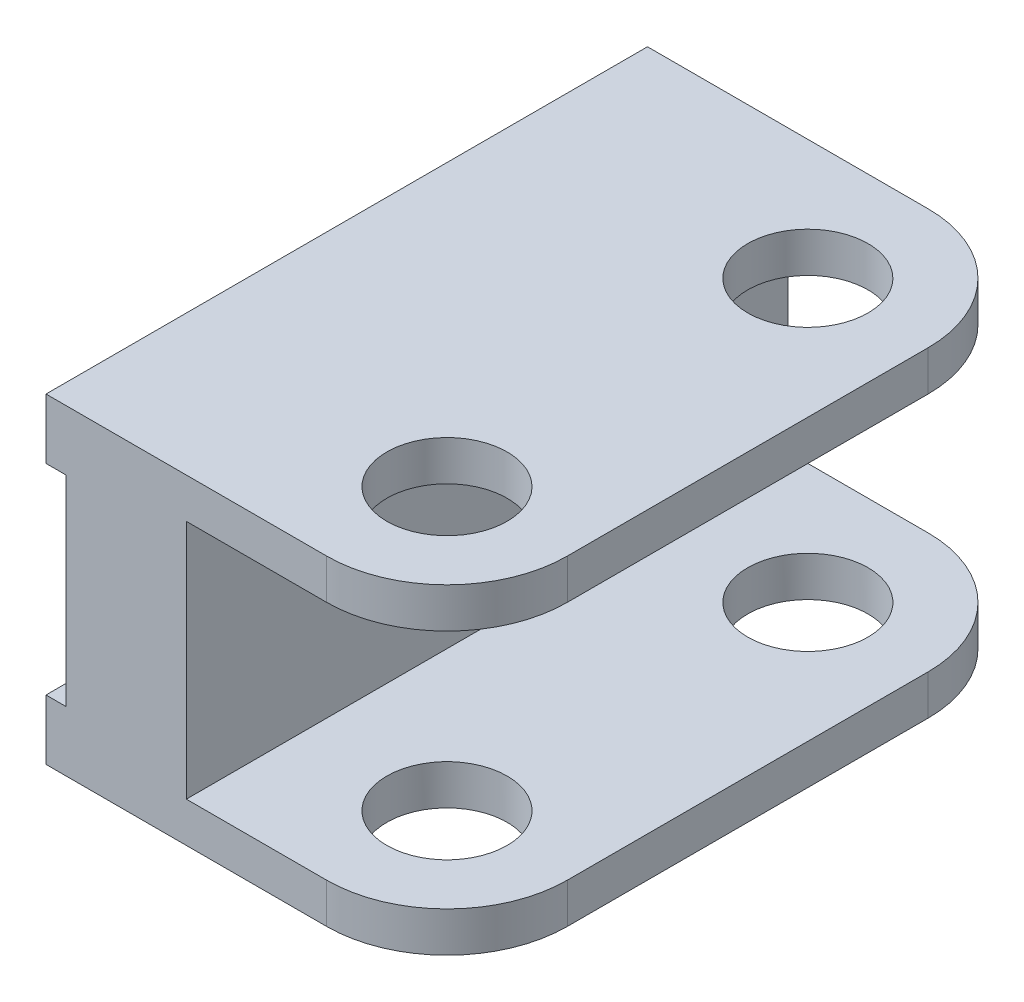
ISO-10303-21;
HEADER;
FILE_DESCRIPTION(('STEP AP214'),'2;1');
FILE_NAME('part.step','',(''),(''),'','','');
FILE_SCHEMA(('AUTOMOTIVE_DESIGN { 1 0 10303 214 1 1 1 1 }'));
ENDSEC;
DATA;
#1=APPLICATION_CONTEXT('core data for automotive mechanical design processes');
#2=APPLICATION_PROTOCOL_DEFINITION('international standard','automotive_design',2000,#1);
#3=PRODUCT_CONTEXT('',#1,'mechanical');
#4=PRODUCT('Part','Part','',(#3));
#5=PRODUCT_RELATED_PRODUCT_CATEGORY('part','',(#4));
#6=PRODUCT_DEFINITION_FORMATION('','',#4);
#7=PRODUCT_DEFINITION_CONTEXT('part definition',#1,'design');
#8=PRODUCT_DEFINITION('design','',#6,#7);
#9=PRODUCT_DEFINITION_SHAPE('','',#8);
#10=(LENGTH_UNIT() NAMED_UNIT(*) SI_UNIT(.MILLI.,.METRE.));
#11=(NAMED_UNIT(*) PLANE_ANGLE_UNIT() SI_UNIT($,.RADIAN.));
#12=(NAMED_UNIT(*) SI_UNIT($,.STERADIAN.) SOLID_ANGLE_UNIT());
#13=UNCERTAINTY_MEASURE_WITH_UNIT(LENGTH_MEASURE(1.E-05),#10,'distance_accuracy_value','');
#14=(GEOMETRIC_REPRESENTATION_CONTEXT(3) GLOBAL_UNCERTAINTY_ASSIGNED_CONTEXT((#13)) GLOBAL_UNIT_ASSIGNED_CONTEXT((#10,
#11,#12)) REPRESENTATION_CONTEXT('',''));
#15=CARTESIAN_POINT('',(0.,0.,0.));
#16=DIRECTION('',(0.,0.,1.));
#17=DIRECTION('',(1.,0.,0.));
#18=AXIS2_PLACEMENT_3D('',#15,#16,#17);
#19=CARTESIAN_POINT('',(0.,0.,150.));
#20=DIRECTION('',(1.,0.,0.));
#21=DIRECTION('',(0.,1.,0.));
#22=AXIS2_PLACEMENT_3D('',#19,#20,#21);
#23=PLANE('',#22);
#24=DIRECTION('',(0.,-1.,0.));
#25=VECTOR('',#24,1.);
#26=CARTESIAN_POINT('',(0.,0.,0.));
#27=LINE('',#26,#25);
#28=CARTESIAN_POINT('',(0.,80.,0.));
#29=VERTEX_POINT('',#28);
#30=CARTESIAN_POINT('',(0.,65.,0.));
#31=VERTEX_POINT('',#30);
#32=EDGE_CURVE('E175',#29,#31,#27,.T.);
#33=ORIENTED_EDGE('',*,*,#32,.T.);
#34=DIRECTION('',(0.,0.,1.));
#35=VECTOR('',#34,1.);
#36=CARTESIAN_POINT('',(0.,65.,0.));
#37=LINE('',#36,#35);
#38=CARTESIAN_POINT('',(0.,65.,150.));
#39=VERTEX_POINT('',#38);
#40=EDGE_CURVE('E176',#31,#39,#37,.T.);
#41=ORIENTED_EDGE('',*,*,#40,.T.);
#42=DIRECTION('',(0.,-1.,0.));
#43=VECTOR('',#42,1.);
#44=CARTESIAN_POINT('',(0.,0.,150.));
#45=LINE('',#44,#43);
#46=CARTESIAN_POINT('',(0.,80.,150.));
#47=VERTEX_POINT('',#46);
#48=EDGE_CURVE('E269',#47,#39,#45,.T.);
#49=ORIENTED_EDGE('',*,*,#48,.F.);
#50=DIRECTION('',(0.,0.,-1.));
#51=VECTOR('',#50,1.);
#52=CARTESIAN_POINT('',(0.,80.,150.));
#53=LINE('',#52,#51);
#54=EDGE_CURVE('E196',#47,#29,#53,.T.);
#55=ORIENTED_EDGE('',*,*,#54,.T.);
#56=EDGE_LOOP('',(#33,#41,#49,#55));
#57=FACE_BOUND('',#56,.T.);
#58=ADVANCED_FACE('F33',(#57),#23,.F.);
#59=CARTESIAN_POINT('',(0.,15.,150.));
#60=VERTEX_POINT('',#59);
#61=CARTESIAN_POINT('',(0.,0.,150.));
#62=VERTEX_POINT('',#61);
#63=EDGE_CURVE('E167',#60,#62,#45,.T.);
#64=ORIENTED_EDGE('',*,*,#63,.F.);
#65=DIRECTION('',(0.,0.,1.));
#66=VECTOR('',#65,1.);
#67=CARTESIAN_POINT('',(0.,15.,0.));
#68=LINE('',#67,#66);
#69=CARTESIAN_POINT('',(0.,15.,0.));
#70=VERTEX_POINT('',#69);
#71=EDGE_CURVE('E152',#70,#60,#68,.T.);
#72=ORIENTED_EDGE('',*,*,#71,.F.);
#73=CARTESIAN_POINT('',(0.,0.,0.));
#74=VERTEX_POINT('',#73);
#75=EDGE_CURVE('E165',#70,#74,#27,.T.);
#76=ORIENTED_EDGE('',*,*,#75,.T.);
#77=DIRECTION('',(0.,0.,-1.));
#78=VECTOR('',#77,1.);
#79=CARTESIAN_POINT('',(0.,0.,150.));
#80=LINE('',#79,#78);
#81=EDGE_CURVE('E217',#62,#74,#80,.T.);
#82=ORIENTED_EDGE('',*,*,#81,.F.);
#83=EDGE_LOOP('',(#64,#72,#76,#82));
#84=FACE_BOUND('',#83,.T.);
#85=ADVANCED_FACE('F163',(#84),#23,.F.);
#86=CARTESIAN_POINT('',(35.,0.,150.));
#87=DIRECTION('',(0.,1.,0.));
#88=DIRECTION('',(0.,0.,1.));
#89=AXIS2_PLACEMENT_3D('',#86,#87,#88);
#90=PLANE('',#89);
#91=CARTESIAN_POINT('',(70.,0.,120.));
#92=DIRECTION('',(0.,1.,0.));
#93=DIRECTION('',(0.,0.,1.));
#94=AXIS2_PLACEMENT_3D('',#91,#92,#93);
#95=CIRCLE('',#94,15.);
#96=CARTESIAN_POINT('',(70.,0.,135.));
#97=VERTEX_POINT('',#96);
#98=EDGE_CURVE('E294',#97,#97,#95,.T.);
#99=ORIENTED_EDGE('',*,*,#98,.T.);
#100=EDGE_LOOP('',(#99));
#101=FACE_BOUND('',#100,.T.);
#102=CARTESIAN_POINT('',(70.,0.,30.));
#103=DIRECTION('',(0.,1.,0.));
#104=DIRECTION('',(0.,0.,1.));
#105=AXIS2_PLACEMENT_3D('',#102,#103,#104);
#106=CIRCLE('',#105,15.);
#107=CARTESIAN_POINT('',(70.,0.,45.));
#108=VERTEX_POINT('',#107);
#109=EDGE_CURVE('E279',#108,#108,#106,.T.);
#110=ORIENTED_EDGE('',*,*,#109,.T.);
#111=EDGE_LOOP('',(#110));
#112=FACE_BOUND('',#111,.T.);
#113=DIRECTION('',(1.,0.,0.));
#114=VECTOR('',#113,1.);
#115=CARTESIAN_POINT('',(35.,0.,0.));
#116=LINE('',#115,#114);
#117=CARTESIAN_POINT('',(70.,0.,0.));
#118=VERTEX_POINT('',#117);
#119=EDGE_CURVE('E173',#74,#118,#116,.T.);
#120=ORIENTED_EDGE('',*,*,#119,.T.);
#121=CARTESIAN_POINT('',(70.,0.,30.));
#122=DIRECTION('',(0.,1.,0.));
#123=DIRECTION('',(0.,0.,1.));
#124=AXIS2_PLACEMENT_3D('',#121,#122,#123);
#125=CIRCLE('',#124,30.);
#126=CARTESIAN_POINT('',(100.,0.,30.));
#127=VERTEX_POINT('',#126);
#128=EDGE_CURVE('E245',#118,#127,#125,.F.);
#129=ORIENTED_EDGE('',*,*,#128,.T.);
#130=DIRECTION('',(0.,0.,-1.));
#131=VECTOR('',#130,1.);
#132=CARTESIAN_POINT('',(100.,0.,150.));
#133=LINE('',#132,#131);
#134=CARTESIAN_POINT('',(100.,0.,120.));
#135=VERTEX_POINT('',#134);
#136=EDGE_CURVE('E214',#135,#127,#133,.T.);
#137=ORIENTED_EDGE('',*,*,#136,.F.);
#138=CARTESIAN_POINT('',(70.,0.,120.));
#139=DIRECTION('',(0.,1.,0.));
#140=DIRECTION('',(0.,0.,1.));
#141=AXIS2_PLACEMENT_3D('',#138,#139,#140);
#142=CIRCLE('',#141,30.);
#143=CARTESIAN_POINT('',(70.,0.,150.));
#144=VERTEX_POINT('',#143);
#145=EDGE_CURVE('E48',#135,#144,#142,.F.);
#146=ORIENTED_EDGE('',*,*,#145,.T.);
#147=DIRECTION('',(1.,0.,0.));
#148=VECTOR('',#147,1.);
#149=CARTESIAN_POINT('',(0.,0.,150.));
#150=LINE('',#149,#148);
#151=EDGE_CURVE('E267',#62,#144,#150,.T.);
#152=ORIENTED_EDGE('',*,*,#151,.F.);
#153=ORIENTED_EDGE('',*,*,#81,.T.);
#154=EDGE_LOOP('',(#120,#129,#137,#146,#152,#153));
#155=FACE_BOUND('',#154,.T.);
#156=ADVANCED_FACE('F349',(#101,#112,#155),#90,.F.);
#157=CARTESIAN_POINT('',(100.,0.,150.));
#158=DIRECTION('',(-1.,0.,0.));
#159=DIRECTION('',(0.,0.,1.));
#160=AXIS2_PLACEMENT_3D('',#157,#158,#159);
#161=PLANE('',#160);
#162=ORIENTED_EDGE('',*,*,#136,.T.);
#163=DIRECTION('',(0.,1.,0.));
#164=VECTOR('',#163,1.);
#165=CARTESIAN_POINT('',(100.,10.,30.));
#166=LINE('',#165,#164);
#167=CARTESIAN_POINT('',(100.,10.,30.));
#168=VERTEX_POINT('',#167);
#169=EDGE_CURVE('E238',#127,#168,#166,.T.);
#170=ORIENTED_EDGE('',*,*,#169,.T.);
#171=DIRECTION('',(0.,0.,-1.));
#172=VECTOR('',#171,1.);
#173=CARTESIAN_POINT('',(100.,10.,150.));
#174=LINE('',#173,#172);
#175=CARTESIAN_POINT('',(100.,10.,120.));
#176=VERTEX_POINT('',#175);
#177=EDGE_CURVE('E211',#176,#168,#174,.T.);
#178=ORIENTED_EDGE('',*,*,#177,.F.);
#179=DIRECTION('',(0.,1.,0.));
#180=VECTOR('',#179,1.);
#181=CARTESIAN_POINT('',(100.,0.,120.));
#182=LINE('',#181,#180);
#183=EDGE_CURVE('E236',#176,#135,#182,.F.);
#184=ORIENTED_EDGE('',*,*,#183,.T.);
#185=EDGE_LOOP('',(#162,#170,#178,#184));
#186=FACE_BOUND('',#185,.T.);
#187=ADVANCED_FACE('F357',(#186),#161,.F.);
#188=CARTESIAN_POINT('',(35.,10.,150.));
#189=DIRECTION('',(0.,-1.,0.));
#190=DIRECTION('',(0.,0.,-1.));
#191=AXIS2_PLACEMENT_3D('',#188,#189,#190);
#192=PLANE('',#191);
#193=CARTESIAN_POINT('',(70.,9.99999999999999,120.));
#194=DIRECTION('',(0.,-1.,0.));
#195=DIRECTION('',(0.,0.,-1.));
#196=AXIS2_PLACEMENT_3D('',#193,#194,#195);
#197=CIRCLE('',#196,15.);
#198=CARTESIAN_POINT('',(70.,9.99999999999999,105.));
#199=VERTEX_POINT('',#198);
#200=EDGE_CURVE('E297',#199,#199,#197,.T.);
#201=ORIENTED_EDGE('',*,*,#200,.T.);
#202=EDGE_LOOP('',(#201));
#203=FACE_BOUND('',#202,.T.);
#204=CARTESIAN_POINT('',(70.,9.99999999999999,30.));
#205=DIRECTION('',(0.,-1.,0.));
#206=DIRECTION('',(0.,0.,-1.));
#207=AXIS2_PLACEMENT_3D('',#204,#205,#206);
#208=CIRCLE('',#207,15.);
#209=CARTESIAN_POINT('',(70.,9.99999999999999,15.));
#210=VERTEX_POINT('',#209);
#211=EDGE_CURVE('E285',#210,#210,#208,.T.);
#212=ORIENTED_EDGE('',*,*,#211,.T.);
#213=EDGE_LOOP('',(#212));
#214=FACE_BOUND('',#213,.T.);
#215=ORIENTED_EDGE('',*,*,#177,.T.);
#216=CARTESIAN_POINT('',(70.,10.,30.));
#217=DIRECTION('',(0.,-1.,0.));
#218=DIRECTION('',(0.,0.,-1.));
#219=AXIS2_PLACEMENT_3D('',#216,#217,#218);
#220=CIRCLE('',#219,30.);
#221=CARTESIAN_POINT('',(70.,10.,0.));
#222=VERTEX_POINT('',#221);
#223=EDGE_CURVE('E242',#168,#222,#220,.F.);
#224=ORIENTED_EDGE('',*,*,#223,.T.);
#225=DIRECTION('',(-1.,0.,0.));
#226=VECTOR('',#225,1.);
#227=CARTESIAN_POINT('',(35.,10.,0.));
#228=LINE('',#227,#226);
#229=CARTESIAN_POINT('',(35.,10.,0.));
#230=VERTEX_POINT('',#229);
#231=EDGE_CURVE('E187',#222,#230,#228,.T.);
#232=ORIENTED_EDGE('',*,*,#231,.T.);
#233=DIRECTION('',(0.,0.,-1.));
#234=VECTOR('',#233,1.);
#235=CARTESIAN_POINT('',(35.,10.,150.));
#236=LINE('',#235,#234);
#237=CARTESIAN_POINT('',(35.,10.,150.));
#238=VERTEX_POINT('',#237);
#239=EDGE_CURVE('E208',#238,#230,#236,.T.);
#240=ORIENTED_EDGE('',*,*,#239,.F.);
#241=DIRECTION('',(-1.,0.,0.));
#242=VECTOR('',#241,1.);
#243=CARTESIAN_POINT('',(35.,10.,150.));
#244=LINE('',#243,#242);
#245=CARTESIAN_POINT('',(70.,10.,150.));
#246=VERTEX_POINT('',#245);
#247=EDGE_CURVE('E263',#246,#238,#244,.T.);
#248=ORIENTED_EDGE('',*,*,#247,.F.);
#249=CARTESIAN_POINT('',(70.,10.,120.));
#250=DIRECTION('',(0.,-1.,0.));
#251=DIRECTION('',(0.,0.,-1.));
#252=AXIS2_PLACEMENT_3D('',#249,#250,#251);
#253=CIRCLE('',#252,30.);
#254=EDGE_CURVE('E56',#246,#176,#253,.F.);
#255=ORIENTED_EDGE('',*,*,#254,.T.);
#256=EDGE_LOOP('',(#215,#224,#232,#240,#248,#255));
#257=FACE_BOUND('',#256,.T.);
#258=ADVANCED_FACE('F359',(#203,#214,#257),#192,.F.);
#259=CARTESIAN_POINT('',(35.,10.,150.));
#260=DIRECTION('',(-1.,0.,0.));
#261=DIRECTION('',(0.,-1.,0.));
#262=AXIS2_PLACEMENT_3D('',#259,#260,#261);
#263=PLANE('',#262);
#264=DIRECTION('',(0.,1.,0.));
#265=VECTOR('',#264,1.);
#266=CARTESIAN_POINT('',(35.,10.,0.));
#267=LINE('',#266,#265);
#268=CARTESIAN_POINT('',(35.,70.,0.));
#269=VERTEX_POINT('',#268);
#270=EDGE_CURVE('E189',#230,#269,#267,.T.);
#271=ORIENTED_EDGE('',*,*,#270,.T.);
#272=DIRECTION('',(0.,0.,-1.));
#273=VECTOR('',#272,1.);
#274=CARTESIAN_POINT('',(35.,70.,150.));
#275=LINE('',#274,#273);
#276=CARTESIAN_POINT('',(35.,70.,150.));
#277=VERTEX_POINT('',#276);
#278=EDGE_CURVE('E205',#277,#269,#275,.T.);
#279=ORIENTED_EDGE('',*,*,#278,.F.);
#280=DIRECTION('',(0.,1.,0.));
#281=VECTOR('',#280,1.);
#282=CARTESIAN_POINT('',(35.,10.,150.));
#283=LINE('',#282,#281);
#284=EDGE_CURVE('E262',#238,#277,#283,.T.);
#285=ORIENTED_EDGE('',*,*,#284,.F.);
#286=ORIENTED_EDGE('',*,*,#239,.T.);
#287=EDGE_LOOP('',(#271,#279,#285,#286));
#288=FACE_BOUND('',#287,.T.);
#289=ADVANCED_FACE('F326',(#288),#263,.F.);
#290=CARTESIAN_POINT('',(35.,70.,150.));
#291=DIRECTION('',(0.,1.,0.));
#292=DIRECTION('',(0.,0.,1.));
#293=AXIS2_PLACEMENT_3D('',#290,#291,#292);
#294=PLANE('',#293);
#295=CARTESIAN_POINT('',(70.,70.,120.));
#296=DIRECTION('',(0.,1.,0.));
#297=DIRECTION('',(0.,0.,1.));
#298=AXIS2_PLACEMENT_3D('',#295,#296,#297);
#299=CIRCLE('',#298,15.);
#300=CARTESIAN_POINT('',(70.,70.,135.));
#301=VERTEX_POINT('',#300);
#302=EDGE_CURVE('E300',#301,#301,#299,.T.);
#303=ORIENTED_EDGE('',*,*,#302,.T.);
#304=EDGE_LOOP('',(#303));
#305=FACE_BOUND('',#304,.T.);
#306=CARTESIAN_POINT('',(70.,70.,30.));
#307=DIRECTION('',(0.,1.,0.));
#308=DIRECTION('',(0.,0.,1.));
#309=AXIS2_PLACEMENT_3D('',#306,#307,#308);
#310=CIRCLE('',#309,15.);
#311=CARTESIAN_POINT('',(70.,70.,45.));
#312=VERTEX_POINT('',#311);
#313=EDGE_CURVE('E288',#312,#312,#310,.T.);
#314=ORIENTED_EDGE('',*,*,#313,.T.);
#315=EDGE_LOOP('',(#314));
#316=FACE_BOUND('',#315,.T.);
#317=DIRECTION('',(1.,0.,0.));
#318=VECTOR('',#317,1.);
#319=CARTESIAN_POINT('',(35.,70.,0.));
#320=LINE('',#319,#318);
#321=CARTESIAN_POINT('',(70.,70.,0.));
#322=VERTEX_POINT('',#321);
#323=EDGE_CURVE('E191',#269,#322,#320,.T.);
#324=ORIENTED_EDGE('',*,*,#323,.T.);
#325=CARTESIAN_POINT('',(70.,70.,30.));
#326=DIRECTION('',(0.,1.,0.));
#327=DIRECTION('',(0.,0.,1.));
#328=AXIS2_PLACEMENT_3D('',#325,#326,#327);
#329=CIRCLE('',#328,30.);
#330=CARTESIAN_POINT('',(100.,70.,30.));
#331=VERTEX_POINT('',#330);
#332=EDGE_CURVE('E234',#322,#331,#329,.F.);
#333=ORIENTED_EDGE('',*,*,#332,.T.);
#334=DIRECTION('',(0.,0.,-1.));
#335=VECTOR('',#334,1.);
#336=CARTESIAN_POINT('',(100.,70.,150.));
#337=LINE('',#336,#335);
#338=CARTESIAN_POINT('',(100.,70.,120.));
#339=VERTEX_POINT('',#338);
#340=EDGE_CURVE('E202',#339,#331,#337,.T.);
#341=ORIENTED_EDGE('',*,*,#340,.F.);
#342=CARTESIAN_POINT('',(70.,70.,120.));
#343=DIRECTION('',(0.,1.,0.));
#344=DIRECTION('',(0.,0.,1.));
#345=AXIS2_PLACEMENT_3D('',#342,#343,#344);
#346=CIRCLE('',#345,30.);
#347=CARTESIAN_POINT('',(70.,70.,150.));
#348=VERTEX_POINT('',#347);
#349=EDGE_CURVE('E232',#339,#348,#346,.F.);
#350=ORIENTED_EDGE('',*,*,#349,.T.);
#351=DIRECTION('',(1.,0.,0.));
#352=VECTOR('',#351,1.);
#353=CARTESIAN_POINT('',(35.,70.,150.));
#354=LINE('',#353,#352);
#355=EDGE_CURVE('E255',#277,#348,#354,.T.);
#356=ORIENTED_EDGE('',*,*,#355,.F.);
#357=ORIENTED_EDGE('',*,*,#278,.T.);
#358=EDGE_LOOP('',(#324,#333,#341,#350,#356,#357));
#359=FACE_BOUND('',#358,.T.);
#360=ADVANCED_FACE('F323',(#305,#316,#359),#294,.F.);
#361=CARTESIAN_POINT('',(100.,80.,150.));
#362=DIRECTION('',(-1.,0.,0.));
#363=DIRECTION('',(0.,-1.,0.));
#364=AXIS2_PLACEMENT_3D('',#361,#362,#363);
#365=PLANE('',#364);
#366=ORIENTED_EDGE('',*,*,#340,.T.);
#367=DIRECTION('',(0.,1.,0.));
#368=VECTOR('',#367,1.);
#369=CARTESIAN_POINT('',(100.,80.,30.));
#370=LINE('',#369,#368);
#371=CARTESIAN_POINT('',(100.,80.,30.));
#372=VERTEX_POINT('',#371);
#373=EDGE_CURVE('E221',#331,#372,#370,.T.);
#374=ORIENTED_EDGE('',*,*,#373,.T.);
#375=DIRECTION('',(0.,0.,-1.));
#376=VECTOR('',#375,1.);
#377=CARTESIAN_POINT('',(100.,80.,150.));
#378=LINE('',#377,#376);
#379=CARTESIAN_POINT('',(100.,80.,120.));
#380=VERTEX_POINT('',#379);
#381=EDGE_CURVE('E199',#380,#372,#378,.T.);
#382=ORIENTED_EDGE('',*,*,#381,.F.);
#383=DIRECTION('',(0.,1.,0.));
#384=VECTOR('',#383,1.);
#385=CARTESIAN_POINT('',(100.,80.,120.));
#386=LINE('',#385,#384);
#387=EDGE_CURVE('E219',#380,#339,#386,.F.);
#388=ORIENTED_EDGE('',*,*,#387,.T.);
#389=EDGE_LOOP('',(#366,#374,#382,#388));
#390=FACE_BOUND('',#389,.T.);
#391=ADVANCED_FACE('F312',(#390),#365,.F.);
#392=CARTESIAN_POINT('',(0.,80.,150.));
#393=DIRECTION('',(0.,-1.,0.));
#394=DIRECTION('',(0.,0.,-1.));
#395=AXIS2_PLACEMENT_3D('',#392,#393,#394);
#396=PLANE('',#395);
#397=CARTESIAN_POINT('',(70.,80.,120.));
#398=DIRECTION('',(0.,1.,0.));
#399=DIRECTION('',(0.,0.,1.));
#400=AXIS2_PLACEMENT_3D('',#397,#398,#399);
#401=CIRCLE('',#400,15.);
#402=CARTESIAN_POINT('',(70.,80.,135.));
#403=VERTEX_POINT('',#402);
#404=EDGE_CURVE('E303',#403,#403,#401,.T.);
#405=ORIENTED_EDGE('',*,*,#404,.F.);
#406=EDGE_LOOP('',(#405));
#407=FACE_BOUND('',#406,.T.);
#408=CARTESIAN_POINT('',(70.,80.,30.));
#409=DIRECTION('',(0.,1.,0.));
#410=DIRECTION('',(0.,0.,1.));
#411=AXIS2_PLACEMENT_3D('',#408,#409,#410);
#412=CIRCLE('',#411,15.);
#413=CARTESIAN_POINT('',(70.,80.,45.));
#414=VERTEX_POINT('',#413);
#415=EDGE_CURVE('E291',#414,#414,#412,.T.);
#416=ORIENTED_EDGE('',*,*,#415,.F.);
#417=EDGE_LOOP('',(#416));
#418=FACE_BOUND('',#417,.T.);
#419=ORIENTED_EDGE('',*,*,#381,.T.);
#420=CARTESIAN_POINT('',(70.,80.,30.));
#421=DIRECTION('',(0.,-1.,0.));
#422=DIRECTION('',(0.,0.,-1.));
#423=AXIS2_PLACEMENT_3D('',#420,#421,#422);
#424=CIRCLE('',#423,30.);
#425=CARTESIAN_POINT('',(70.,80.,0.));
#426=VERTEX_POINT('',#425);
#427=EDGE_CURVE('E226',#372,#426,#424,.F.);
#428=ORIENTED_EDGE('',*,*,#427,.T.);
#429=DIRECTION('',(-1.,0.,0.));
#430=VECTOR('',#429,1.);
#431=CARTESIAN_POINT('',(0.,80.,0.));
#432=LINE('',#431,#430);
#433=EDGE_CURVE('E194',#426,#29,#432,.T.);
#434=ORIENTED_EDGE('',*,*,#433,.T.);
#435=ORIENTED_EDGE('',*,*,#54,.F.);
#436=DIRECTION('',(-1.,0.,0.));
#437=VECTOR('',#436,1.);
#438=CARTESIAN_POINT('',(35.,80.,150.));
#439=LINE('',#438,#437);
#440=CARTESIAN_POINT('',(70.,80.,150.));
#441=VERTEX_POINT('',#440);
#442=EDGE_CURVE('E184',#441,#47,#439,.T.);
#443=ORIENTED_EDGE('',*,*,#442,.F.);
#444=CARTESIAN_POINT('',(70.,80.,120.));
#445=DIRECTION('',(0.,-1.,0.));
#446=DIRECTION('',(0.,0.,-1.));
#447=AXIS2_PLACEMENT_3D('',#444,#445,#446);
#448=CIRCLE('',#447,30.);
#449=EDGE_CURVE('E224',#441,#380,#448,.F.);
#450=ORIENTED_EDGE('',*,*,#449,.T.);
#451=EDGE_LOOP('',(#419,#428,#434,#435,#443,#450));
#452=FACE_BOUND('',#451,.T.);
#453=ADVANCED_FACE('F259',(#407,#418,#452),#396,.F.);
#454=CARTESIAN_POINT('',(0.,0.,150.));
#455=DIRECTION('',(0.,0.,-1.));
#456=DIRECTION('',(-1.,0.,0.));
#457=AXIS2_PLACEMENT_3D('',#454,#455,#456);
#458=PLANE('',#457);
#459=ORIENTED_EDGE('',*,*,#151,.T.);
#460=DIRECTION('',(0.,1.,0.));
#461=VECTOR('',#460,1.);
#462=CARTESIAN_POINT('',(70.,0.,150.));
#463=LINE('',#462,#461);
#464=EDGE_CURVE('E11',#144,#246,#463,.T.);
#465=ORIENTED_EDGE('',*,*,#464,.T.);
#466=ORIENTED_EDGE('',*,*,#247,.T.);
#467=ORIENTED_EDGE('',*,*,#284,.T.);
#468=ORIENTED_EDGE('',*,*,#355,.T.);
#469=DIRECTION('',(0.,1.,0.));
#470=VECTOR('',#469,1.);
#471=CARTESIAN_POINT('',(70.0000000000001,0.,150.));
#472=LINE('',#471,#470);
#473=EDGE_CURVE('E41',#348,#441,#472,.T.);
#474=ORIENTED_EDGE('',*,*,#473,.T.);
#475=ORIENTED_EDGE('',*,*,#442,.T.);
#476=ORIENTED_EDGE('',*,*,#48,.T.);
#477=DIRECTION('',(-1.,0.,0.));
#478=VECTOR('',#477,1.);
#479=CARTESIAN_POINT('',(0.,65.,150.));
#480=LINE('',#479,#478);
#481=CARTESIAN_POINT('',(4.99999999999999,65.,150.));
#482=VERTEX_POINT('',#481);
#483=EDGE_CURVE('E159',#482,#39,#480,.T.);
#484=ORIENTED_EDGE('',*,*,#483,.F.);
#485=DIRECTION('',(0.,1.,0.));
#486=VECTOR('',#485,1.);
#487=CARTESIAN_POINT('',(4.99999999999999,65.,150.));
#488=LINE('',#487,#486);
#489=CARTESIAN_POINT('',(5.00000000000001,15.,150.));
#490=VERTEX_POINT('',#489);
#491=EDGE_CURVE('E274',#490,#482,#488,.T.);
#492=ORIENTED_EDGE('',*,*,#491,.F.);
#493=DIRECTION('',(1.,0.,0.));
#494=VECTOR('',#493,1.);
#495=CARTESIAN_POINT('',(0.,15.,150.));
#496=LINE('',#495,#494);
#497=EDGE_CURVE('E277',#60,#490,#496,.T.);
#498=ORIENTED_EDGE('',*,*,#497,.F.);
#499=ORIENTED_EDGE('',*,*,#63,.T.);
#500=EDGE_LOOP('',(#459,#465,#466,#467,#468,#474,#475,#476,#484,#492,#498,#499));
#501=FACE_BOUND('',#500,.T.);
#502=ADVANCED_FACE('F251',(#501),#458,.F.);
#503=CARTESIAN_POINT('',(0.,0.,0.));
#504=DIRECTION('',(0.,0.,-1.));
#505=DIRECTION('',(-1.,0.,0.));
#506=AXIS2_PLACEMENT_3D('',#503,#504,#505);
#507=PLANE('',#506);
#508=ORIENTED_EDGE('',*,*,#433,.F.);
#509=DIRECTION('',(0.,1.,0.));
#510=VECTOR('',#509,1.);
#511=CARTESIAN_POINT('',(70.,70.,0.));
#512=LINE('',#511,#510);
#513=EDGE_CURVE('E230',#426,#322,#512,.F.);
#514=ORIENTED_EDGE('',*,*,#513,.T.);
#515=ORIENTED_EDGE('',*,*,#323,.F.);
#516=ORIENTED_EDGE('',*,*,#270,.F.);
#517=ORIENTED_EDGE('',*,*,#231,.F.);
#518=DIRECTION('',(0.,1.,0.));
#519=VECTOR('',#518,1.);
#520=CARTESIAN_POINT('',(70.,0.,0.));
#521=LINE('',#520,#519);
#522=EDGE_CURVE('E228',#222,#118,#521,.F.);
#523=ORIENTED_EDGE('',*,*,#522,.T.);
#524=ORIENTED_EDGE('',*,*,#119,.F.);
#525=ORIENTED_EDGE('',*,*,#75,.F.);
#526=DIRECTION('',(1.,0.,0.));
#527=VECTOR('',#526,1.);
#528=CARTESIAN_POINT('',(0.,15.,0.));
#529=LINE('',#528,#527);
#530=CARTESIAN_POINT('',(5.00000000000001,15.,0.));
#531=VERTEX_POINT('',#530);
#532=EDGE_CURVE('E148',#70,#531,#529,.T.);
#533=ORIENTED_EDGE('',*,*,#532,.T.);
#534=DIRECTION('',(0.,1.,0.));
#535=VECTOR('',#534,1.);
#536=CARTESIAN_POINT('',(4.99999999999999,65.,0.));
#537=LINE('',#536,#535);
#538=CARTESIAN_POINT('',(4.99999999999999,65.,0.));
#539=VERTEX_POINT('',#538);
#540=EDGE_CURVE('E158',#531,#539,#537,.T.);
#541=ORIENTED_EDGE('',*,*,#540,.T.);
#542=DIRECTION('',(-1.,0.,0.));
#543=VECTOR('',#542,1.);
#544=CARTESIAN_POINT('',(0.,65.,0.));
#545=LINE('',#544,#543);
#546=EDGE_CURVE('E168',#539,#31,#545,.T.);
#547=ORIENTED_EDGE('',*,*,#546,.T.);
#548=ORIENTED_EDGE('',*,*,#32,.F.);
#549=EDGE_LOOP('',(#508,#514,#515,#516,#517,#523,#524,#525,#533,#541,#547,#548));
#550=FACE_BOUND('',#549,.T.);
#551=ADVANCED_FACE('F171',(#550),#507,.T.);
#552=CARTESIAN_POINT('',(0.,65.,0.));
#553=DIRECTION('',(0.,1.,0.));
#554=DIRECTION('',(0.,0.,1.));
#555=AXIS2_PLACEMENT_3D('',#552,#553,#554);
#556=PLANE('',#555);
#557=ORIENTED_EDGE('',*,*,#483,.T.);
#558=ORIENTED_EDGE('',*,*,#40,.F.);
#559=ORIENTED_EDGE('',*,*,#546,.F.);
#560=DIRECTION('',(0.,0.,1.));
#561=VECTOR('',#560,1.);
#562=CARTESIAN_POINT('',(4.99999999999999,65.,0.));
#563=LINE('',#562,#561);
#564=EDGE_CURVE('E180',#539,#482,#563,.T.);
#565=ORIENTED_EDGE('',*,*,#564,.T.);
#566=EDGE_LOOP('',(#557,#558,#559,#565));
#567=FACE_BOUND('',#566,.T.);
#568=ADVANCED_FACE('F346',(#567),#556,.F.);
#569=CARTESIAN_POINT('',(4.99999999999999,65.,0.));
#570=DIRECTION('',(1.,0.,0.));
#571=DIRECTION('',(0.,1.,0.));
#572=AXIS2_PLACEMENT_3D('',#569,#570,#571);
#573=PLANE('',#572);
#574=ORIENTED_EDGE('',*,*,#491,.T.);
#575=ORIENTED_EDGE('',*,*,#564,.F.);
#576=ORIENTED_EDGE('',*,*,#540,.F.);
#577=DIRECTION('',(0.,0.,1.));
#578=VECTOR('',#577,1.);
#579=CARTESIAN_POINT('',(5.00000000000001,15.,0.));
#580=LINE('',#579,#578);
#581=EDGE_CURVE('E154',#531,#490,#580,.T.);
#582=ORIENTED_EDGE('',*,*,#581,.T.);
#583=EDGE_LOOP('',(#574,#575,#576,#582));
#584=FACE_BOUND('',#583,.T.);
#585=ADVANCED_FACE('F348',(#584),#573,.F.);
#586=CARTESIAN_POINT('',(0.,15.,0.));
#587=DIRECTION('',(0.,-1.,0.));
#588=DIRECTION('',(0.,0.,-1.));
#589=AXIS2_PLACEMENT_3D('',#586,#587,#588);
#590=PLANE('',#589);
#591=ORIENTED_EDGE('',*,*,#497,.T.);
#592=ORIENTED_EDGE('',*,*,#581,.F.);
#593=ORIENTED_EDGE('',*,*,#532,.F.);
#594=ORIENTED_EDGE('',*,*,#71,.T.);
#595=EDGE_LOOP('',(#591,#592,#593,#594));
#596=FACE_BOUND('',#595,.T.);
#597=ADVANCED_FACE('F151',(#596),#590,.F.);
#598=CARTESIAN_POINT('',(70.,-70.,30.));
#599=DIRECTION('',(0.,1.,0.));
#600=DIRECTION('',(0.,0.,1.));
#601=AXIS2_PLACEMENT_3D('',#598,#599,#600);
#602=CYLINDRICAL_SURFACE('',#601,15.);
#603=ORIENTED_EDGE('',*,*,#415,.T.);
#604=EDGE_LOOP('',(#603));
#605=FACE_BOUND('',#604,.T.);
#606=ORIENTED_EDGE('',*,*,#313,.F.);
#607=EDGE_LOOP('',(#606));
#608=FACE_BOUND('',#607,.T.);
#609=ADVANCED_FACE('F316',(#605,#608),#602,.F.);
#610=ORIENTED_EDGE('',*,*,#211,.F.);
#611=EDGE_LOOP('',(#610));
#612=FACE_BOUND('',#611,.T.);
#613=ORIENTED_EDGE('',*,*,#109,.F.);
#614=EDGE_LOOP('',(#613));
#615=FACE_BOUND('',#614,.T.);
#616=ADVANCED_FACE('F319',(#612,#615),#602,.F.);
#617=CARTESIAN_POINT('',(70.,-70.,120.));
#618=DIRECTION('',(0.,1.,0.));
#619=DIRECTION('',(0.,0.,1.));
#620=AXIS2_PLACEMENT_3D('',#617,#618,#619);
#621=CYLINDRICAL_SURFACE('',#620,15.);
#622=ORIENTED_EDGE('',*,*,#404,.T.);
#623=EDGE_LOOP('',(#622));
#624=FACE_BOUND('',#623,.T.);
#625=ORIENTED_EDGE('',*,*,#302,.F.);
#626=EDGE_LOOP('',(#625));
#627=FACE_BOUND('',#626,.T.);
#628=ADVANCED_FACE('F307',(#624,#627),#621,.F.);
#629=ORIENTED_EDGE('',*,*,#200,.F.);
#630=EDGE_LOOP('',(#629));
#631=FACE_BOUND('',#630,.T.);
#632=ORIENTED_EDGE('',*,*,#98,.F.);
#633=EDGE_LOOP('',(#632));
#634=FACE_BOUND('',#633,.T.);
#635=ADVANCED_FACE('F380',(#631,#634),#621,.F.);
#636=CARTESIAN_POINT('',(70.,80.,30.));
#637=DIRECTION('',(0.,-1.,0.));
#638=DIRECTION('',(1.,0.,0.));
#639=AXIS2_PLACEMENT_3D('',#636,#637,#638);
#640=CYLINDRICAL_SURFACE('',#639,30.);
#641=ORIENTED_EDGE('',*,*,#332,.F.);
#642=ORIENTED_EDGE('',*,*,#513,.F.);
#643=ORIENTED_EDGE('',*,*,#427,.F.);
#644=ORIENTED_EDGE('',*,*,#373,.F.);
#645=EDGE_LOOP('',(#641,#642,#643,#644));
#646=FACE_BOUND('',#645,.T.);
#647=ADVANCED_FACE('F337',(#646),#640,.T.);
#648=CARTESIAN_POINT('',(70.,0.,30.));
#649=DIRECTION('',(0.,-1.,0.));
#650=DIRECTION('',(0.,0.,-1.));
#651=AXIS2_PLACEMENT_3D('',#648,#649,#650);
#652=CYLINDRICAL_SURFACE('',#651,30.);
#653=ORIENTED_EDGE('',*,*,#128,.F.);
#654=ORIENTED_EDGE('',*,*,#522,.F.);
#655=ORIENTED_EDGE('',*,*,#223,.F.);
#656=ORIENTED_EDGE('',*,*,#169,.F.);
#657=EDGE_LOOP('',(#653,#654,#655,#656));
#658=FACE_BOUND('',#657,.T.);
#659=ADVANCED_FACE('F354',(#658),#652,.T.);
#660=CARTESIAN_POINT('',(70.,0.,120.));
#661=DIRECTION('',(0.,1.,0.));
#662=DIRECTION('',(0.,0.,1.));
#663=AXIS2_PLACEMENT_3D('',#660,#661,#662);
#664=CYLINDRICAL_SURFACE('',#663,30.);
#665=ORIENTED_EDGE('',*,*,#145,.F.);
#666=ORIENTED_EDGE('',*,*,#183,.F.);
#667=ORIENTED_EDGE('',*,*,#254,.F.);
#668=ORIENTED_EDGE('',*,*,#464,.F.);
#669=EDGE_LOOP('',(#665,#666,#667,#668));
#670=FACE_BOUND('',#669,.T.);
#671=ADVANCED_FACE('F364',(#670),#664,.T.);
#672=CARTESIAN_POINT('',(70.0000000000001,0.,120.));
#673=DIRECTION('',(0.,1.,0.));
#674=DIRECTION('',(-1.,0.,0.));
#675=AXIS2_PLACEMENT_3D('',#672,#673,#674);
#676=CYLINDRICAL_SURFACE('',#675,30.);
#677=ORIENTED_EDGE('',*,*,#349,.F.);
#678=ORIENTED_EDGE('',*,*,#387,.F.);
#679=ORIENTED_EDGE('',*,*,#449,.F.);
#680=ORIENTED_EDGE('',*,*,#473,.F.);
#681=EDGE_LOOP('',(#677,#678,#679,#680));
#682=FACE_BOUND('',#681,.T.);
#683=ADVANCED_FACE('F35',(#682),#676,.T.);
#684=CLOSED_SHELL('',(#58,#85,#156,#187,#258,#289,#360,#391,#453,#502,#551,#568,#585,#597,#609,
#616,#628,#635,#647,#659,#671,#683));
#685=MANIFOLD_SOLID_BREP('B2',#684);
#686=ADVANCED_BREP_SHAPE_REPRESENTATION('',(#18,#685),#14);
#687=SHAPE_DEFINITION_REPRESENTATION(#9,#686);
ENDSEC;
END-ISO-10303-21;
